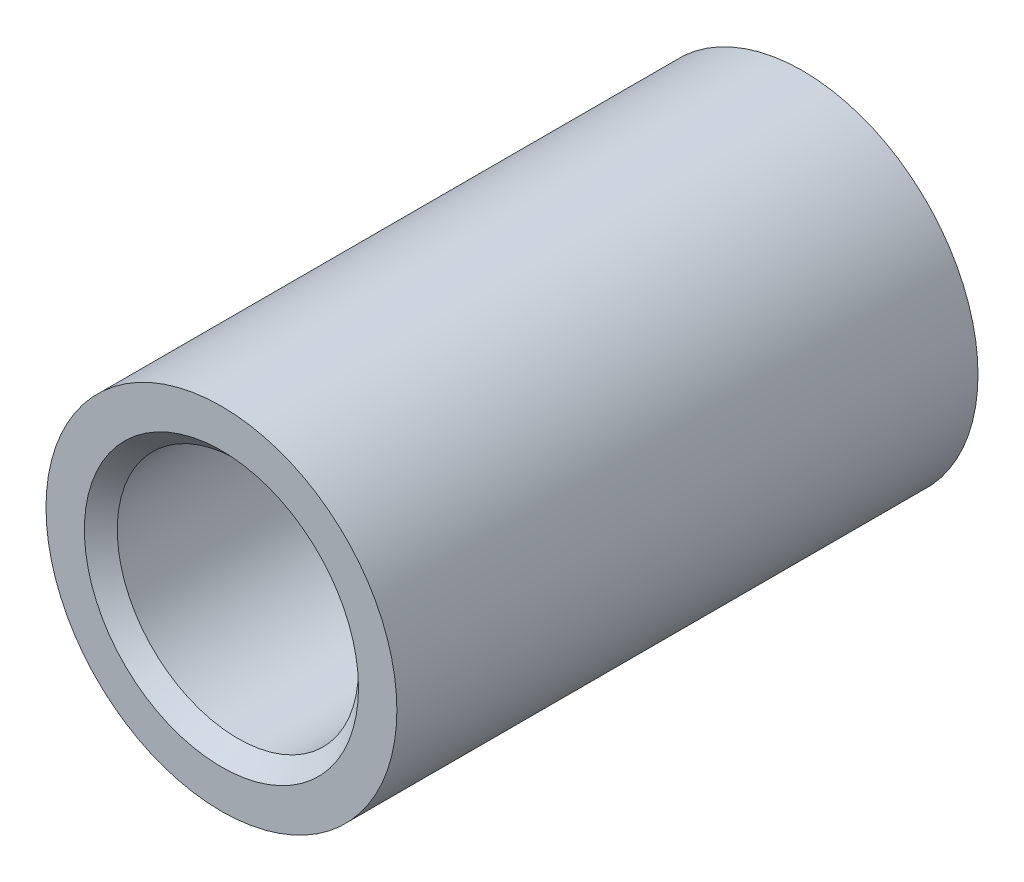
ISO-10303-21;
HEADER;
FILE_DESCRIPTION(('STEP AP214'),'2;1');
FILE_NAME('part.step','',(''),(''),'','','');
FILE_SCHEMA(('AUTOMOTIVE_DESIGN { 1 0 10303 214 1 1 1 1 }'));
ENDSEC;
DATA;
#1=APPLICATION_CONTEXT('core data for automotive mechanical design processes');
#2=APPLICATION_PROTOCOL_DEFINITION('international standard','automotive_design',2000,#1);
#3=PRODUCT_CONTEXT('',#1,'mechanical');
#4=PRODUCT('Part','Part','',(#3));
#5=PRODUCT_RELATED_PRODUCT_CATEGORY('part','',(#4));
#6=PRODUCT_DEFINITION_FORMATION('','',#4);
#7=PRODUCT_DEFINITION_CONTEXT('part definition',#1,'design');
#8=PRODUCT_DEFINITION('design','',#6,#7);
#9=PRODUCT_DEFINITION_SHAPE('','',#8);
#10=(LENGTH_UNIT() NAMED_UNIT(*) SI_UNIT(.MILLI.,.METRE.));
#11=(NAMED_UNIT(*) PLANE_ANGLE_UNIT() SI_UNIT($,.RADIAN.));
#12=(NAMED_UNIT(*) SI_UNIT($,.STERADIAN.) SOLID_ANGLE_UNIT());
#13=UNCERTAINTY_MEASURE_WITH_UNIT(LENGTH_MEASURE(1.E-05),#10,'distance_accuracy_value','');
#14=(GEOMETRIC_REPRESENTATION_CONTEXT(3) GLOBAL_UNCERTAINTY_ASSIGNED_CONTEXT((#13)) GLOBAL_UNIT_ASSIGNED_CONTEXT((#10,
#11,#12)) REPRESENTATION_CONTEXT('',''));
#15=CARTESIAN_POINT('',(0.,0.,0.));
#16=DIRECTION('',(0.,0.,1.));
#17=DIRECTION('',(1.,0.,0.));
#18=AXIS2_PLACEMENT_3D('',#15,#16,#17);
#19=CARTESIAN_POINT('',(0.,0.,53.));
#20=DIRECTION('',(0.,0.,1.));
#21=DIRECTION('',(1.,0.,0.));
#22=AXIS2_PLACEMENT_3D('',#19,#20,#21);
#23=PLANE('',#22);
#24=CARTESIAN_POINT('',(0.,0.,53.));
#25=DIRECTION('',(0.,0.,1.));
#26=DIRECTION('',(1.,0.,0.));
#27=AXIS2_PLACEMENT_3D('',#24,#25,#26);
#28=CIRCLE('',#27,12.5);
#29=CARTESIAN_POINT('',(12.5,0.,53.));
#30=VERTEX_POINT('',#29);
#31=EDGE_CURVE('E10',#30,#30,#28,.F.);
#32=ORIENTED_EDGE('',*,*,#31,.T.);
#33=EDGE_LOOP('',(#32));
#34=FACE_BOUND('',#33,.T.);
#35=CARTESIAN_POINT('',(0.,0.,53.));
#36=DIRECTION('',(0.,0.,1.));
#37=DIRECTION('',(1.,0.,0.));
#38=AXIS2_PLACEMENT_3D('',#35,#36,#37);
#39=CIRCLE('',#38,16.);
#40=CARTESIAN_POINT('',(16.,0.,53.));
#41=VERTEX_POINT('',#40);
#42=EDGE_CURVE('E55',#41,#41,#39,.T.);
#43=ORIENTED_EDGE('',*,*,#42,.T.);
#44=EDGE_LOOP('',(#43));
#45=FACE_BOUND('',#44,.T.);
#46=ADVANCED_FACE('F34',(#34,#45),#23,.T.);
#47=CARTESIAN_POINT('',(0.,0.,0.));
#48=DIRECTION('',(0.,0.,1.));
#49=DIRECTION('',(1.,0.,0.));
#50=AXIS2_PLACEMENT_3D('',#47,#48,#49);
#51=PLANE('',#50);
#52=CARTESIAN_POINT('',(0.,0.,0.));
#53=DIRECTION('',(0.,0.,1.));
#54=DIRECTION('',(1.,0.,0.));
#55=AXIS2_PLACEMENT_3D('',#52,#53,#54);
#56=CIRCLE('',#55,12.5);
#57=CARTESIAN_POINT('',(12.5,0.,0.));
#58=VERTEX_POINT('',#57);
#59=EDGE_CURVE('E50',#58,#58,#56,.T.);
#60=ORIENTED_EDGE('',*,*,#59,.T.);
#61=EDGE_LOOP('',(#60));
#62=FACE_BOUND('',#61,.T.);
#63=CARTESIAN_POINT('',(0.,0.,0.));
#64=DIRECTION('',(0.,0.,1.));
#65=DIRECTION('',(1.,0.,0.));
#66=AXIS2_PLACEMENT_3D('',#63,#64,#65);
#67=CIRCLE('',#66,16.);
#68=CARTESIAN_POINT('',(16.,0.,0.));
#69=VERTEX_POINT('',#68);
#70=EDGE_CURVE('E56',#69,#69,#67,.T.);
#71=ORIENTED_EDGE('',*,*,#70,.F.);
#72=EDGE_LOOP('',(#71));
#73=FACE_BOUND('',#72,.T.);
#74=ADVANCED_FACE('F67',(#62,#73),#51,.F.);
#75=CARTESIAN_POINT('',(0.,0.,53.));
#76=DIRECTION('',(0.,0.,-1.));
#77=DIRECTION('',(-1.,0.,0.));
#78=AXIS2_PLACEMENT_3D('',#75,#76,#77);
#79=CYLINDRICAL_SURFACE('',#78,16.);
#80=ORIENTED_EDGE('',*,*,#42,.F.);
#81=EDGE_LOOP('',(#80));
#82=FACE_BOUND('',#81,.T.);
#83=ORIENTED_EDGE('',*,*,#70,.T.);
#84=EDGE_LOOP('',(#83));
#85=FACE_BOUND('',#84,.T.);
#86=ADVANCED_FACE('F63',(#82,#85),#79,.T.);
#87=CARTESIAN_POINT('',(0.,0.,53.));
#88=DIRECTION('',(0.,0.,-1.));
#89=DIRECTION('',(-1.,0.,0.));
#90=AXIS2_PLACEMENT_3D('',#87,#88,#89);
#91=CYLINDRICAL_SURFACE('',#90,11.);
#92=CARTESIAN_POINT('',(0.,0.,1.5));
#93=DIRECTION('',(0.,0.,1.));
#94=DIRECTION('',(1.,0.,0.));
#95=AXIS2_PLACEMENT_3D('',#92,#93,#94);
#96=CIRCLE('',#95,11.);
#97=CARTESIAN_POINT('',(11.,0.,1.5));
#98=VERTEX_POINT('',#97);
#99=EDGE_CURVE('E42',#98,#98,#96,.F.);
#100=ORIENTED_EDGE('',*,*,#99,.T.);
#101=EDGE_LOOP('',(#100));
#102=FACE_BOUND('',#101,.T.);
#103=CARTESIAN_POINT('',(0.,0.,51.5));
#104=DIRECTION('',(0.,0.,1.));
#105=DIRECTION('',(1.,0.,0.));
#106=AXIS2_PLACEMENT_3D('',#103,#104,#105);
#107=CIRCLE('',#106,11.);
#108=CARTESIAN_POINT('',(11.,0.,51.5));
#109=VERTEX_POINT('',#108);
#110=EDGE_CURVE('E46',#109,#109,#107,.T.);
#111=ORIENTED_EDGE('',*,*,#110,.T.);
#112=EDGE_LOOP('',(#111));
#113=FACE_BOUND('',#112,.T.);
#114=ADVANCED_FACE('F66',(#102,#113),#91,.F.);
#115=CARTESIAN_POINT('',(0.,0.,0.));
#116=DIRECTION('',(0.,0.,-1.));
#117=DIRECTION('',(-1.,0.,0.));
#118=AXIS2_PLACEMENT_3D('',#115,#116,#117);
#119=CONICAL_SURFACE('',#118,12.5,0.785398163397447);
#120=ORIENTED_EDGE('',*,*,#99,.F.);
#121=EDGE_LOOP('',(#120));
#122=FACE_BOUND('',#121,.T.);
#123=ORIENTED_EDGE('',*,*,#59,.F.);
#124=EDGE_LOOP('',(#123));
#125=FACE_BOUND('',#124,.T.);
#126=ADVANCED_FACE('F80',(#122,#125),#119,.F.);
#127=CARTESIAN_POINT('',(0.,0.,51.5));
#128=DIRECTION('',(0.,0.,1.));
#129=DIRECTION('',(1.,0.,0.));
#130=AXIS2_PLACEMENT_3D('',#127,#128,#129);
#131=CONICAL_SURFACE('',#130,11.,0.78539816339745);
#132=CARTESIAN_POINT('',(12.5,0.,53.));
#133=CARTESIAN_POINT('',(12.484375,0.,52.984375));
#134=CARTESIAN_POINT('',(12.46875,0.,52.96875));
#135=CARTESIAN_POINT('',(12.4375,0.,52.9375));
#136=CARTESIAN_POINT('',(12.421875,0.,52.921875));
#137=CARTESIAN_POINT('',(12.390625,0.,52.890625));
#138=CARTESIAN_POINT('',(12.375,0.,52.875));
#139=CARTESIAN_POINT('',(12.34375,0.,52.84375));
#140=CARTESIAN_POINT('',(12.328125,0.,52.828125));
#141=CARTESIAN_POINT('',(12.296875,0.,52.796875));
#142=CARTESIAN_POINT('',(12.28125,0.,52.78125));
#143=CARTESIAN_POINT('',(12.25,0.,52.75));
#144=CARTESIAN_POINT('',(12.234375,0.,52.734375));
#145=CARTESIAN_POINT('',(12.203125,0.,52.703125));
#146=CARTESIAN_POINT('',(12.1875,0.,52.6875));
#147=CARTESIAN_POINT('',(12.15625,0.,52.65625));
#148=CARTESIAN_POINT('',(12.140625,0.,52.640625));
#149=CARTESIAN_POINT('',(12.109375,0.,52.609375));
#150=CARTESIAN_POINT('',(12.09375,0.,52.59375));
#151=CARTESIAN_POINT('',(12.0625,0.,52.5625));
#152=CARTESIAN_POINT('',(12.046875,0.,52.546875));
#153=CARTESIAN_POINT('',(12.015625,0.,52.515625));
#154=CARTESIAN_POINT('',(12.,0.,52.5));
#155=CARTESIAN_POINT('',(11.96875,0.,52.46875));
#156=CARTESIAN_POINT('',(11.953125,0.,52.453125));
#157=CARTESIAN_POINT('',(11.921875,0.,52.421875));
#158=CARTESIAN_POINT('',(11.90625,0.,52.40625));
#159=CARTESIAN_POINT('',(11.875,0.,52.375));
#160=CARTESIAN_POINT('',(11.859375,0.,52.359375));
#161=CARTESIAN_POINT('',(11.828125,0.,52.328125));
#162=CARTESIAN_POINT('',(11.8125,0.,52.3125));
#163=CARTESIAN_POINT('',(11.78125,0.,52.28125));
#164=CARTESIAN_POINT('',(11.765625,0.,52.265625));
#165=CARTESIAN_POINT('',(11.734375,0.,52.234375));
#166=CARTESIAN_POINT('',(11.71875,0.,52.21875));
#167=CARTESIAN_POINT('',(11.6875,0.,52.1875));
#168=CARTESIAN_POINT('',(11.671875,0.,52.171875));
#169=CARTESIAN_POINT('',(11.640625,0.,52.140625));
#170=CARTESIAN_POINT('',(11.625,0.,52.125));
#171=CARTESIAN_POINT('',(11.59375,0.,52.09375));
#172=CARTESIAN_POINT('',(11.578125,0.,52.078125));
#173=CARTESIAN_POINT('',(11.546875,0.,52.046875));
#174=CARTESIAN_POINT('',(11.53125,0.,52.03125));
#175=CARTESIAN_POINT('',(11.5,0.,52.));
#176=CARTESIAN_POINT('',(11.484375,0.,51.984375));
#177=CARTESIAN_POINT('',(11.453125,0.,51.953125));
#178=CARTESIAN_POINT('',(11.4375,0.,51.9375));
#179=CARTESIAN_POINT('',(11.40625,0.,51.90625));
#180=CARTESIAN_POINT('',(11.390625,0.,51.890625));
#181=CARTESIAN_POINT('',(11.359375,0.,51.859375));
#182=CARTESIAN_POINT('',(11.34375,0.,51.84375));
#183=CARTESIAN_POINT('',(11.3125,0.,51.8125));
#184=CARTESIAN_POINT('',(11.296875,0.,51.796875));
#185=CARTESIAN_POINT('',(11.265625,0.,51.765625));
#186=CARTESIAN_POINT('',(11.25,0.,51.75));
#187=CARTESIAN_POINT('',(11.21875,0.,51.71875));
#188=CARTESIAN_POINT('',(11.203125,0.,51.703125));
#189=CARTESIAN_POINT('',(11.171875,0.,51.671875));
#190=CARTESIAN_POINT('',(11.15625,0.,51.65625));
#191=CARTESIAN_POINT('',(11.125,0.,51.625));
#192=CARTESIAN_POINT('',(11.109375,0.,51.609375));
#193=CARTESIAN_POINT('',(11.078125,0.,51.578125));
#194=CARTESIAN_POINT('',(11.0625,0.,51.5625));
#195=CARTESIAN_POINT('',(11.03125,0.,51.53125));
#196=CARTESIAN_POINT('',(11.015625,0.,51.515625));
#197=CARTESIAN_POINT('',(11.,0.,51.5));
#198=B_SPLINE_CURVE_WITH_KNOTS('',3,(#132,#133,#134,#135,#136,#137,#138,#139,#140,#141,#142,
#143,#144,#145,#146,#147,#148,#149,#150,#151,#152,#153,#154,#155,#156,#157,#158,#159,#160,#161,
#162,#163,#164,#165,#166,#167,#168,#169,#170,#171,#172,#173,#174,#175,#176,#177,#178,#179,#180,
#181,#182,#183,#184,#185,#186,#187,#188,#189,#190,#191,#192,#193,#194,#195,#196,#197),
.UNSPECIFIED.,.F.,.F.,(4,2,2,2,2,2,2,2,2,2,2,2,2,2,2,2,2,2,2,2,2,2,2,2,2,2,2,2,2,2,2,2,4),(0.,
0.0662912607362389,0.132582521472479,0.198873782208719,0.265165042944954,0.331456303681194,
0.397747564417433,0.464038825153669,0.530330085889909,0.596621346626149,0.662912607362384,
0.729203868098624,0.795495128834864,0.861786389571098,0.928077650307338,0.994368911043578,
1.06066017177981,1.12695143251605,1.19324269325229,1.25953395398853,1.32582521472477,
1.39211647546101,1.45840773619725,1.52469899693348,1.59099025766972,1.65728151840596,
1.7235727791422,1.78986403987844,1.85615530061468,1.92244656135091,1.98873782208715,
2.05502908282339,2.12132034355963),.UNSPECIFIED.);
#199=EDGE_CURVE('BSEAM37',#30,#109,#198,.T.);
#200=ORIENTED_EDGE('',*,*,#31,.F.);
#201=ORIENTED_EDGE('',*,*,#110,.F.);
#202=ORIENTED_EDGE('',*,*,#199,.T.);
#203=ORIENTED_EDGE('',*,*,#199,.F.);
#204=EDGE_LOOP('',(#200,#202,#201,#203));
#205=FACE_BOUND('',#204,.T.);
#206=ADVANCED_FACE('F37',(#205),#131,.F.);
#207=CLOSED_SHELL('',(#46,#74,#86,#114,#126,#206));
#208=MANIFOLD_SOLID_BREP('B2',#207);
#209=ADVANCED_BREP_SHAPE_REPRESENTATION('',(#18,#208),#14);
#210=SHAPE_DEFINITION_REPRESENTATION(#9,#209);
ENDSEC;
END-ISO-10303-21;
